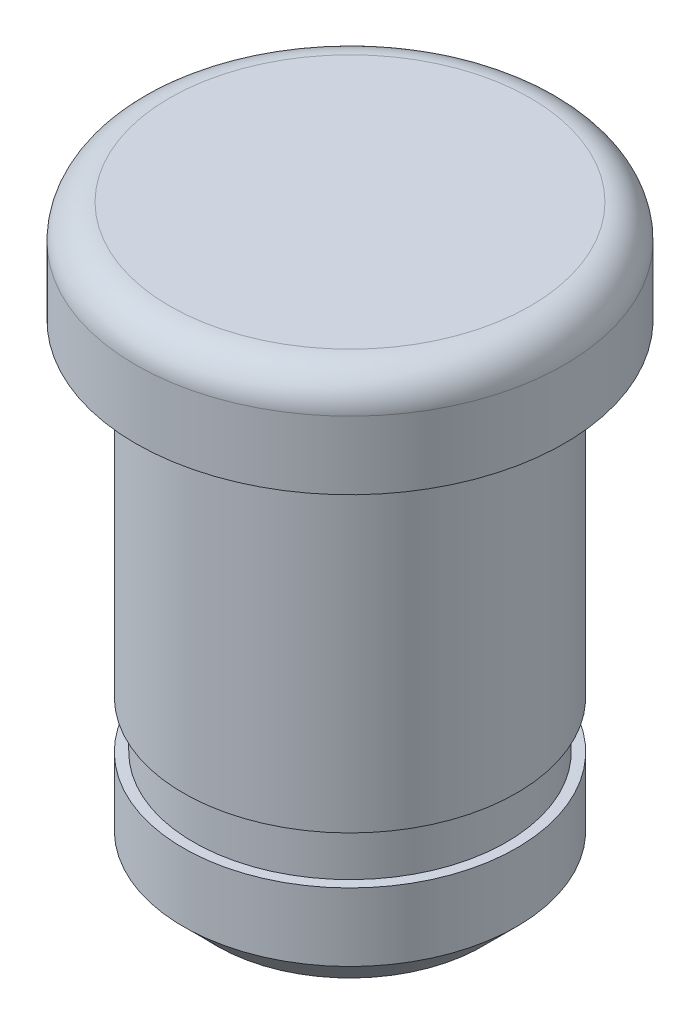
ISO-10303-21;
HEADER;
FILE_DESCRIPTION(('STEP AP214'),'2;1');
FILE_NAME('part.step','',(''),(''),'','','');
FILE_SCHEMA(('AUTOMOTIVE_DESIGN { 1 0 10303 214 1 1 1 1 }'));
ENDSEC;
DATA;
#1=APPLICATION_CONTEXT('core data for automotive mechanical design processes');
#2=APPLICATION_PROTOCOL_DEFINITION('international standard','automotive_design',2000,#1);
#3=PRODUCT_CONTEXT('',#1,'mechanical');
#4=PRODUCT('Part','Part','',(#3));
#5=PRODUCT_RELATED_PRODUCT_CATEGORY('part','',(#4));
#6=PRODUCT_DEFINITION_FORMATION('','',#4);
#7=PRODUCT_DEFINITION_CONTEXT('part definition',#1,'design');
#8=PRODUCT_DEFINITION('design','',#6,#7);
#9=PRODUCT_DEFINITION_SHAPE('','',#8);
#10=(LENGTH_UNIT() NAMED_UNIT(*) SI_UNIT(.MILLI.,.METRE.));
#11=(NAMED_UNIT(*) PLANE_ANGLE_UNIT() SI_UNIT($,.RADIAN.));
#12=(NAMED_UNIT(*) SI_UNIT($,.STERADIAN.) SOLID_ANGLE_UNIT());
#13=UNCERTAINTY_MEASURE_WITH_UNIT(LENGTH_MEASURE(1.E-05),#10,'distance_accuracy_value','');
#14=(GEOMETRIC_REPRESENTATION_CONTEXT(3) GLOBAL_UNCERTAINTY_ASSIGNED_CONTEXT((#13)) GLOBAL_UNIT_ASSIGNED_CONTEXT((#10,
#11,#12)) REPRESENTATION_CONTEXT('',''));
#15=CARTESIAN_POINT('',(0.,0.,0.));
#16=DIRECTION('',(0.,0.,1.));
#17=DIRECTION('',(1.,0.,0.));
#18=AXIS2_PLACEMENT_3D('',#15,#16,#17);
#19=CARTESIAN_POINT('',(0.,-7.,0.));
#20=DIRECTION('',(0.,1.,0.));
#21=DIRECTION('',(0.,0.,1.));
#22=AXIS2_PLACEMENT_3D('',#19,#20,#21);
#23=CONICAL_SURFACE('',#22,1.95,0.785398163397448);
#24=CARTESIAN_POINT('',(0.,-7.,0.));
#25=DIRECTION('',(0.,-1.,0.));
#26=DIRECTION('',(0.,0.,-1.));
#27=AXIS2_PLACEMENT_3D('',#24,#25,#26);
#28=CIRCLE('',#27,1.95);
#29=CARTESIAN_POINT('',(0.,-7.,-1.95));
#30=VERTEX_POINT('',#29);
#31=EDGE_CURVE('E20',#30,#30,#28,.T.);
#32=ORIENTED_EDGE('',*,*,#31,.F.);
#33=EDGE_LOOP('',(#32));
#34=FACE_BOUND('',#33,.T.);
#35=CARTESIAN_POINT('',(0.,-6.5,0.));
#36=DIRECTION('',(0.,1.,0.));
#37=DIRECTION('',(0.,0.,-1.));
#38=AXIS2_PLACEMENT_3D('',#35,#36,#37);
#39=CIRCLE('',#38,2.45);
#40=CARTESIAN_POINT('',(0.,-6.5,-2.45));
#41=VERTEX_POINT('',#40);
#42=EDGE_CURVE('E11',#41,#41,#39,.T.);
#43=ORIENTED_EDGE('',*,*,#42,.F.);
#44=EDGE_LOOP('',(#43));
#45=FACE_BOUND('',#44,.T.);
#46=ADVANCED_FACE('F17',(#34,#45),#23,.T.);
#47=CARTESIAN_POINT('',(0.,-7.,0.));
#48=DIRECTION('',(0.,1.,0.));
#49=DIRECTION('',(0.,0.,1.));
#50=AXIS2_PLACEMENT_3D('',#47,#48,#49);
#51=CYLINDRICAL_SURFACE('',#50,2.45);
#52=ORIENTED_EDGE('',*,*,#42,.T.);
#53=EDGE_LOOP('',(#52));
#54=FACE_BOUND('',#53,.T.);
#55=CARTESIAN_POINT('',(0.,-5.5,0.));
#56=DIRECTION('',(0.,-1.,0.));
#57=DIRECTION('',(0.,0.,-1.));
#58=AXIS2_PLACEMENT_3D('',#55,#56,#57);
#59=CIRCLE('',#58,2.45);
#60=CARTESIAN_POINT('',(0.,-5.5,-2.45));
#61=VERTEX_POINT('',#60);
#62=EDGE_CURVE('E74',#61,#61,#59,.T.);
#63=ORIENTED_EDGE('',*,*,#62,.T.);
#64=EDGE_LOOP('',(#63));
#65=FACE_BOUND('',#64,.T.);
#66=ADVANCED_FACE('F121',(#54,#65),#51,.T.);
#67=CARTESIAN_POINT('',(0.,-7.,0.));
#68=DIRECTION('',(0.,-1.,0.));
#69=DIRECTION('',(0.,0.,-1.));
#70=AXIS2_PLACEMENT_3D('',#67,#68,#69);
#71=PLANE('',#70);
#72=ORIENTED_EDGE('',*,*,#31,.T.);
#73=EDGE_LOOP('',(#72));
#74=FACE_BOUND('',#73,.T.);
#75=ADVANCED_FACE('F127',(#74),#71,.T.);
#76=CARTESIAN_POINT('',(0.,-5.5,0.));
#77=DIRECTION('',(0.,1.,0.));
#78=DIRECTION('',(0.,0.,1.));
#79=AXIS2_PLACEMENT_3D('',#76,#77,#78);
#80=CYLINDRICAL_SURFACE('',#79,2.3);
#81=CARTESIAN_POINT('',(0.,-5.5,0.));
#82=DIRECTION('',(0.,-1.,0.));
#83=DIRECTION('',(0.,0.,-1.));
#84=AXIS2_PLACEMENT_3D('',#81,#82,#83);
#85=CIRCLE('',#84,2.3);
#86=CARTESIAN_POINT('',(0.,-5.5,-2.3));
#87=VERTEX_POINT('',#86);
#88=EDGE_CURVE('E68',#87,#87,#85,.T.);
#89=ORIENTED_EDGE('',*,*,#88,.F.);
#90=EDGE_LOOP('',(#89));
#91=FACE_BOUND('',#90,.T.);
#92=CARTESIAN_POINT('',(0.,-4.8,0.));
#93=DIRECTION('',(0.,-1.,0.));
#94=DIRECTION('',(0.,0.,-1.));
#95=AXIS2_PLACEMENT_3D('',#92,#93,#94);
#96=CIRCLE('',#95,2.3);
#97=CARTESIAN_POINT('',(0.,-4.8,-2.3));
#98=VERTEX_POINT('',#97);
#99=EDGE_CURVE('E64',#98,#98,#96,.T.);
#100=ORIENTED_EDGE('',*,*,#99,.T.);
#101=EDGE_LOOP('',(#100));
#102=FACE_BOUND('',#101,.T.);
#103=ADVANCED_FACE('F65',(#91,#102),#80,.T.);
#104=CARTESIAN_POINT('',(0.,-4.8,0.));
#105=DIRECTION('',(0.,-1.,0.));
#106=DIRECTION('',(0.,0.,-1.));
#107=AXIS2_PLACEMENT_3D('',#104,#105,#106);
#108=PLANE('',#107);
#109=ORIENTED_EDGE('',*,*,#99,.F.);
#110=EDGE_LOOP('',(#109));
#111=FACE_BOUND('',#110,.T.);
#112=CARTESIAN_POINT('',(0.,-4.8,0.));
#113=DIRECTION('',(0.,-1.,0.));
#114=DIRECTION('',(0.,0.,-1.));
#115=AXIS2_PLACEMENT_3D('',#112,#113,#114);
#116=CIRCLE('',#115,2.45);
#117=CARTESIAN_POINT('',(0.,-4.8,-2.45));
#118=VERTEX_POINT('',#117);
#119=EDGE_CURVE('E93',#118,#118,#116,.T.);
#120=ORIENTED_EDGE('',*,*,#119,.T.);
#121=EDGE_LOOP('',(#120));
#122=FACE_BOUND('',#121,.T.);
#123=ADVANCED_FACE('F101',(#111,#122),#108,.T.);
#124=CARTESIAN_POINT('',(0.,-5.5,0.));
#125=DIRECTION('',(0.,-1.,0.));
#126=DIRECTION('',(0.,0.,-1.));
#127=AXIS2_PLACEMENT_3D('',#124,#125,#126);
#128=PLANE('',#127);
#129=ORIENTED_EDGE('',*,*,#88,.T.);
#130=EDGE_LOOP('',(#129));
#131=FACE_BOUND('',#130,.T.);
#132=ORIENTED_EDGE('',*,*,#62,.F.);
#133=EDGE_LOOP('',(#132));
#134=FACE_BOUND('',#133,.T.);
#135=ADVANCED_FACE('F141',(#131,#134),#128,.F.);
#136=CARTESIAN_POINT('',(0.,1.,0.));
#137=DIRECTION('',(0.,1.,0.));
#138=DIRECTION('',(0.,0.,1.));
#139=AXIS2_PLACEMENT_3D('',#136,#137,#138);
#140=TOROIDAL_SURFACE('',#139,2.65,0.5);
#141=CARTESIAN_POINT('',(0.,1.,0.));
#142=DIRECTION('',(0.,-1.,0.));
#143=DIRECTION('',(0.,0.,1.));
#144=AXIS2_PLACEMENT_3D('',#141,#142,#143);
#145=CIRCLE('',#144,3.15);
#146=CARTESIAN_POINT('',(0.,1.,3.15));
#147=VERTEX_POINT('',#146);
#148=EDGE_CURVE('E80',#147,#147,#145,.T.);
#149=ORIENTED_EDGE('',*,*,#148,.F.);
#150=EDGE_LOOP('',(#149));
#151=FACE_BOUND('',#150,.T.);
#152=CARTESIAN_POINT('',(0.,1.5,0.));
#153=DIRECTION('',(0.,1.,0.));
#154=DIRECTION('',(0.,0.,1.));
#155=AXIS2_PLACEMENT_3D('',#152,#153,#154);
#156=CIRCLE('',#155,2.65);
#157=CARTESIAN_POINT('',(0.,1.5,2.65));
#158=VERTEX_POINT('',#157);
#159=EDGE_CURVE('E79',#158,#158,#156,.T.);
#160=ORIENTED_EDGE('',*,*,#159,.F.);
#161=EDGE_LOOP('',(#160));
#162=FACE_BOUND('',#161,.T.);
#163=ADVANCED_FACE('F142',(#151,#162),#140,.T.);
#164=CARTESIAN_POINT('',(0.,0.,0.));
#165=DIRECTION('',(0.,1.,0.));
#166=DIRECTION('',(1.,0.,0.));
#167=AXIS2_PLACEMENT_3D('',#164,#165,#166);
#168=PLANE('',#167);
#169=CARTESIAN_POINT('',(0.,0.,0.));
#170=DIRECTION('',(0.,-1.,0.));
#171=DIRECTION('',(0.,0.,-1.));
#172=AXIS2_PLACEMENT_3D('',#169,#170,#171);
#173=CIRCLE('',#172,2.45);
#174=CARTESIAN_POINT('',(0.,0.,-2.45));
#175=VERTEX_POINT('',#174);
#176=EDGE_CURVE('E87',#175,#175,#173,.T.);
#177=ORIENTED_EDGE('',*,*,#176,.F.);
#178=EDGE_LOOP('',(#177));
#179=FACE_BOUND('',#178,.T.);
#180=CARTESIAN_POINT('',(0.,0.,0.));
#181=DIRECTION('',(0.,1.,0.));
#182=DIRECTION('',(0.,0.,1.));
#183=AXIS2_PLACEMENT_3D('',#180,#181,#182);
#184=CIRCLE('',#183,3.15);
#185=CARTESIAN_POINT('',(0.,0.,3.15));
#186=VERTEX_POINT('',#185);
#187=EDGE_CURVE('E83',#186,#186,#184,.T.);
#188=ORIENTED_EDGE('',*,*,#187,.F.);
#189=EDGE_LOOP('',(#188));
#190=FACE_BOUND('',#189,.T.);
#191=ADVANCED_FACE('F145',(#179,#190),#168,.F.);
#192=CARTESIAN_POINT('',(0.,1.5,0.));
#193=DIRECTION('',(0.,1.,0.));
#194=DIRECTION('',(1.,0.,0.));
#195=AXIS2_PLACEMENT_3D('',#192,#193,#194);
#196=PLANE('',#195);
#197=ORIENTED_EDGE('',*,*,#159,.T.);
#198=EDGE_LOOP('',(#197));
#199=FACE_BOUND('',#198,.T.);
#200=ADVANCED_FACE('F115',(#199),#196,.T.);
#201=CARTESIAN_POINT('',(0.,1.5,0.));
#202=DIRECTION('',(0.,-1.,0.));
#203=DIRECTION('',(0.,0.,-1.));
#204=AXIS2_PLACEMENT_3D('',#201,#202,#203);
#205=CYLINDRICAL_SURFACE('',#204,3.15);
#206=ORIENTED_EDGE('',*,*,#148,.T.);
#207=EDGE_LOOP('',(#206));
#208=FACE_BOUND('',#207,.T.);
#209=ORIENTED_EDGE('',*,*,#187,.T.);
#210=EDGE_LOOP('',(#209));
#211=FACE_BOUND('',#210,.T.);
#212=ADVANCED_FACE('F107',(#208,#211),#205,.T.);
#213=CARTESIAN_POINT('',(0.,-7.,0.));
#214=DIRECTION('',(0.,1.,0.));
#215=DIRECTION('',(0.,0.,1.));
#216=AXIS2_PLACEMENT_3D('',#213,#214,#215);
#217=CYLINDRICAL_SURFACE('',#216,2.45);
#218=ORIENTED_EDGE('',*,*,#176,.T.);
#219=EDGE_LOOP('',(#218));
#220=FACE_BOUND('',#219,.T.);
#221=ORIENTED_EDGE('',*,*,#119,.F.);
#222=EDGE_LOOP('',(#221));
#223=FACE_BOUND('',#222,.T.);
#224=ADVANCED_FACE('F105',(#220,#223),#217,.T.);
#225=CLOSED_SHELL('',(#46,#66,#75,#103,#123,#135,#163,#191,#200,#212,#224));
#226=MANIFOLD_SOLID_BREP('B1',#225);
#227=ADVANCED_BREP_SHAPE_REPRESENTATION('',(#18,#226),#14);
#228=SHAPE_DEFINITION_REPRESENTATION(#9,#227);
ENDSEC;
END-ISO-10303-21;
